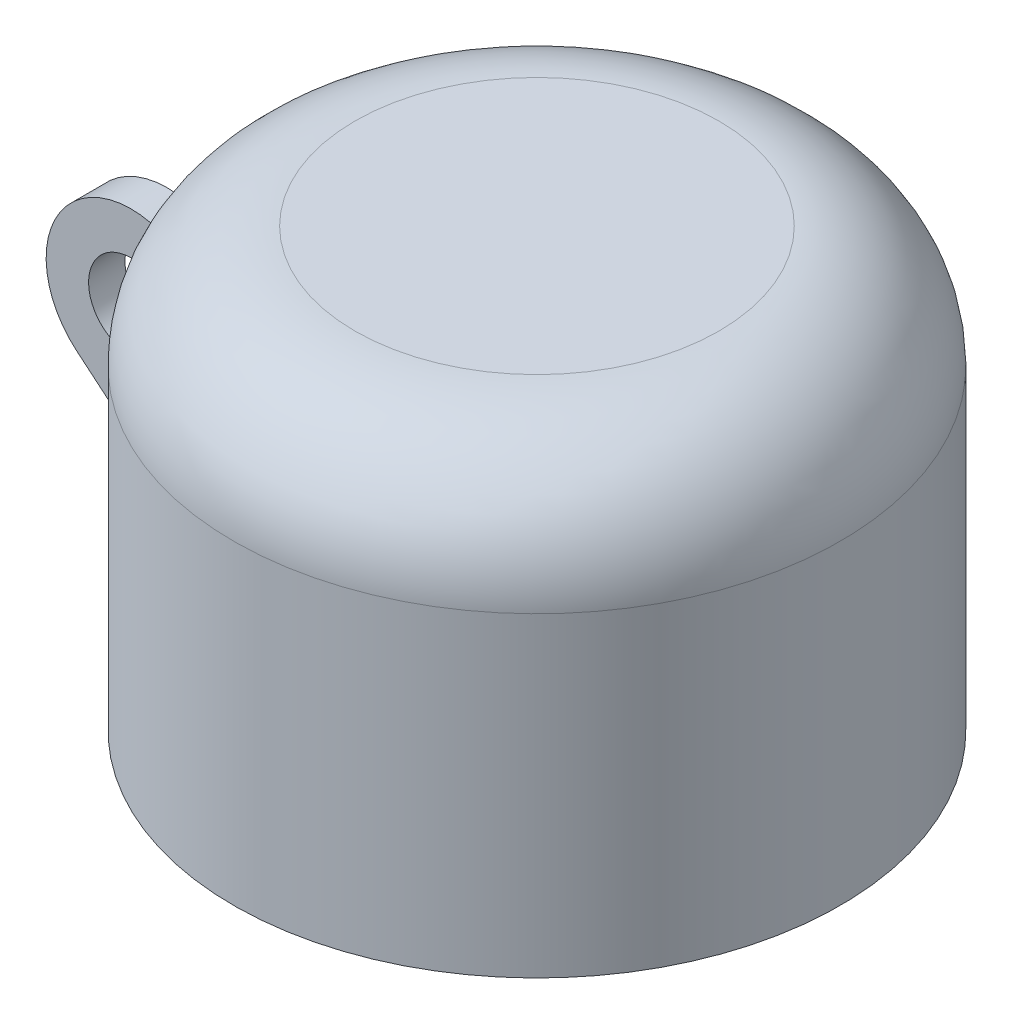
ISO-10303-21;
HEADER;
FILE_DESCRIPTION(('STEP AP214'),'2;1');
FILE_NAME('part.step','',(''),(''),'','','');
FILE_SCHEMA(('AUTOMOTIVE_DESIGN { 1 0 10303 214 1 1 1 1 }'));
ENDSEC;
DATA;
#1=APPLICATION_CONTEXT('core data for automotive mechanical design processes');
#2=APPLICATION_PROTOCOL_DEFINITION('international standard','automotive_design',2000,#1);
#3=PRODUCT_CONTEXT('',#1,'mechanical');
#4=PRODUCT('Part','Part','',(#3));
#5=PRODUCT_RELATED_PRODUCT_CATEGORY('part','',(#4));
#6=PRODUCT_DEFINITION_FORMATION('','',#4);
#7=PRODUCT_DEFINITION_CONTEXT('part definition',#1,'design');
#8=PRODUCT_DEFINITION('design','',#6,#7);
#9=PRODUCT_DEFINITION_SHAPE('','',#8);
#10=(LENGTH_UNIT() NAMED_UNIT(*) SI_UNIT(.MILLI.,.METRE.));
#11=(NAMED_UNIT(*) PLANE_ANGLE_UNIT() SI_UNIT($,.RADIAN.));
#12=(NAMED_UNIT(*) SI_UNIT($,.STERADIAN.) SOLID_ANGLE_UNIT());
#13=UNCERTAINTY_MEASURE_WITH_UNIT(LENGTH_MEASURE(1.E-05),#10,'distance_accuracy_value','');
#14=(GEOMETRIC_REPRESENTATION_CONTEXT(3) GLOBAL_UNCERTAINTY_ASSIGNED_CONTEXT((#13)) GLOBAL_UNIT_ASSIGNED_CONTEXT((#10,
#11,#12)) REPRESENTATION_CONTEXT('',''));
#15=CARTESIAN_POINT('',(0.,0.,0.));
#16=DIRECTION('',(0.,0.,1.));
#17=DIRECTION('',(1.,0.,0.));
#18=AXIS2_PLACEMENT_3D('',#15,#16,#17);
#19=CARTESIAN_POINT('',(0.,36.,0.));
#20=DIRECTION('',(0.,1.,0.));
#21=DIRECTION('',(-1.,0.,0.));
#22=AXIS2_PLACEMENT_3D('',#19,#20,#21);
#23=CYLINDRICAL_SURFACE('',#22,25.);
#24=DIRECTION('',(0.,1.,0.));
#25=VECTOR('',#24,1.);
#26=CARTESIAN_POINT('',(-24.9549594269356,36.,-1.5));
#27=LINE('',#26,#25);
#28=CARTESIAN_POINT('',(-24.9549594269356,25.9999999999999,-1.5));
#29=VERTEX_POINT('',#28);
#30=CARTESIAN_POINT('',(-24.9549594269356,15.,-1.5));
#31=VERTEX_POINT('',#30);
#32=EDGE_CURVE('E102',#29,#31,#27,.F.);
#33=ORIENTED_EDGE('',*,*,#32,.F.);
#34=CARTESIAN_POINT('',(0.,25.9999999999999,0.));
#35=DIRECTION('',(0.,1.,0.));
#36=DIRECTION('',(-1.,0.,0.));
#37=AXIS2_PLACEMENT_3D('',#34,#35,#36);
#38=CIRCLE('',#37,25.);
#39=CARTESIAN_POINT('',(-24.9549594269356,25.9999999999999,1.5));
#40=VERTEX_POINT('',#39);
#41=EDGE_CURVE('E110',#40,#29,#38,.T.);
#42=ORIENTED_EDGE('',*,*,#41,.F.);
#43=DIRECTION('',(0.,-1.,0.));
#44=VECTOR('',#43,1.);
#45=CARTESIAN_POINT('',(-24.9549594269356,25.9999999999999,1.5));
#46=LINE('',#45,#44);
#47=CARTESIAN_POINT('',(-24.9549594269356,15.,1.5));
#48=VERTEX_POINT('',#47);
#49=EDGE_CURVE('E88',#40,#48,#46,.T.);
#50=ORIENTED_EDGE('',*,*,#49,.T.);
#51=DIRECTION('',(0.,1.,0.));
#52=VECTOR('',#51,1.);
#53=CARTESIAN_POINT('',(-24.9549594269356,36.,1.5));
#54=LINE('',#53,#52);
#55=CARTESIAN_POINT('',(-24.9549594269356,0.,1.5));
#56=VERTEX_POINT('',#55);
#57=EDGE_CURVE('E108',#56,#48,#54,.T.);
#58=ORIENTED_EDGE('',*,*,#57,.F.);
#59=CARTESIAN_POINT('',(0.,0.,0.));
#60=DIRECTION('',(0.,1.,0.));
#61=DIRECTION('',(-1.,0.,0.));
#62=AXIS2_PLACEMENT_3D('',#59,#60,#61);
#63=CIRCLE('',#62,25.);
#64=CARTESIAN_POINT('',(-24.9549594269356,0.,-1.5));
#65=VERTEX_POINT('',#64);
#66=EDGE_CURVE('E93',#56,#65,#63,.T.);
#67=ORIENTED_EDGE('',*,*,#66,.T.);
#68=EDGE_CURVE('E97',#31,#65,#27,.F.);
#69=ORIENTED_EDGE('',*,*,#68,.F.);
#70=EDGE_LOOP('',(#33,#42,#50,#58,#67,#69));
#71=FACE_BOUND('',#70,.T.);
#72=ADVANCED_FACE('F40',(#71),#23,.T.);
#73=CARTESIAN_POINT('',(0.,0.,0.));
#74=DIRECTION('',(0.,1.,0.));
#75=DIRECTION('',(-1.,0.,0.));
#76=AXIS2_PLACEMENT_3D('',#73,#74,#75);
#77=PLANE('',#76);
#78=ORIENTED_EDGE('',*,*,#66,.F.);
#79=DIRECTION('',(0.,0.,1.));
#80=VECTOR('',#79,1.);
#81=CARTESIAN_POINT('',(-24.9549594269356,0.,-25.));
#82=LINE('',#81,#80);
#83=EDGE_CURVE('E58',#65,#56,#82,.T.);
#84=ORIENTED_EDGE('',*,*,#83,.F.);
#85=EDGE_LOOP('',(#78,#84));
#86=FACE_BOUND('',#85,.T.);
#87=ADVANCED_FACE('F42',(#86),#77,.F.);
#88=CARTESIAN_POINT('',(0.,26.,0.));
#89=DIRECTION('',(0.,1.,0.));
#90=DIRECTION('',(-1.,0.,0.));
#91=AXIS2_PLACEMENT_3D('',#88,#89,#90);
#92=TOROIDAL_SURFACE('',#91,15.,10.);
#93=CARTESIAN_POINT('',(0.,36.,0.));
#94=DIRECTION('',(0.,1.,0.));
#95=DIRECTION('',(-1.,0.,0.));
#96=AXIS2_PLACEMENT_3D('',#93,#94,#95);
#97=CIRCLE('',#96,14.9999999999999);
#98=CARTESIAN_POINT('',(-14.9999999999999,36.,0.));
#99=VERTEX_POINT('',#98);
#100=EDGE_CURVE('E116',#99,#99,#97,.T.);
#101=ORIENTED_EDGE('',*,*,#100,.F.);
#102=EDGE_LOOP('',(#101));
#103=FACE_BOUND('',#102,.T.);
#104=ORIENTED_EDGE('',*,*,#41,.T.);
#105=CARTESIAN_POINT('',(0.,25.9999999999999,0.));
#106=DIRECTION('',(0.,1.,0.));
#107=DIRECTION('',(-1.,0.,0.));
#108=AXIS2_PLACEMENT_3D('',#105,#106,#107);
#109=CIRCLE('',#108,25.);
#110=EDGE_CURVE('E103',#40,#29,#109,.F.);
#111=ORIENTED_EDGE('',*,*,#110,.F.);
#112=EDGE_LOOP('',(#104,#111));
#113=FACE_BOUND('',#112,.T.);
#114=ADVANCED_FACE('F163',(#103,#113),#92,.T.);
#115=CARTESIAN_POINT('',(14.9999999999999,36.,0.));
#116=DIRECTION('',(0.,-1.,0.));
#117=DIRECTION('',(1.,0.,0.));
#118=AXIS2_PLACEMENT_3D('',#115,#116,#117);
#119=PLANE('',#118);
#120=ORIENTED_EDGE('',*,*,#100,.T.);
#121=EDGE_LOOP('',(#120));
#122=FACE_BOUND('',#121,.T.);
#123=ADVANCED_FACE('F178',(#122),#119,.F.);
#124=CARTESIAN_POINT('',(-40.,25.9999999999999,-1.5));
#125=DIRECTION('',(0.,0.,1.));
#126=DIRECTION('',(0.,-1.,0.));
#127=AXIS2_PLACEMENT_3D('',#124,#125,#126);
#128=PLANE('',#127);
#129=CARTESIAN_POINT('',(-31.9549594269356,15.,-1.5));
#130=DIRECTION('',(0.,0.,1.));
#131=DIRECTION('',(0.,-1.,0.));
#132=AXIS2_PLACEMENT_3D('',#129,#130,#131);
#133=CIRCLE('',#132,3.5);
#134=CARTESIAN_POINT('',(-31.9549594269356,11.5,-1.5));
#135=VERTEX_POINT('',#134);
#136=EDGE_CURVE('E139',#135,#135,#133,.T.);
#137=ORIENTED_EDGE('',*,*,#136,.T.);
#138=EDGE_LOOP('',(#137));
#139=FACE_BOUND('',#138,.T.);
#140=DIRECTION('',(-0.766423357664234,0.642335766423357,0.));
#141=VECTOR('',#140,1.);
#142=CARTESIAN_POINT('',(-46.5923174277899,18.1341667054779,-1.5));
#143=LINE('',#142,#141);
#144=CARTESIAN_POINT('',(-36.4513097918991,9.63503649635036,-1.5));
#145=VERTEX_POINT('',#144);
#146=EDGE_CURVE('E80',#65,#145,#143,.T.);
#147=ORIENTED_EDGE('',*,*,#146,.T.);
#148=CARTESIAN_POINT('',(-31.9549594269356,15.,-1.5));
#149=DIRECTION('',(0.,0.,1.));
#150=DIRECTION('',(0.,-1.,0.));
#151=AXIS2_PLACEMENT_3D('',#148,#149,#150);
#152=CIRCLE('',#151,7.00000000000001);
#153=EDGE_CURVE('E87',#145,#31,#152,.F.);
#154=ORIENTED_EDGE('',*,*,#153,.T.);
#155=ORIENTED_EDGE('',*,*,#68,.T.);
#156=EDGE_LOOP('',(#147,#154,#155));
#157=FACE_BOUND('',#156,.T.);
#158=ADVANCED_FACE('F98',(#139,#157),#128,.F.);
#159=CARTESIAN_POINT('',(-40.,25.9999999999999,1.5));
#160=DIRECTION('',(0.,0.,-1.));
#161=DIRECTION('',(0.,1.,0.));
#162=AXIS2_PLACEMENT_3D('',#159,#160,#161);
#163=PLANE('',#162);
#164=CARTESIAN_POINT('',(-31.9549594269356,15.,1.5));
#165=DIRECTION('',(0.,0.,-1.));
#166=DIRECTION('',(0.,1.,0.));
#167=AXIS2_PLACEMENT_3D('',#164,#165,#166);
#168=CIRCLE('',#167,3.5);
#169=CARTESIAN_POINT('',(-31.9549594269356,18.5,1.5));
#170=VERTEX_POINT('',#169);
#171=EDGE_CURVE('E44',#170,#170,#168,.T.);
#172=ORIENTED_EDGE('',*,*,#171,.T.);
#173=EDGE_LOOP('',(#172));
#174=FACE_BOUND('',#173,.T.);
#175=ORIENTED_EDGE('',*,*,#57,.T.);
#176=CARTESIAN_POINT('',(-31.9549594269356,15.,1.5));
#177=DIRECTION('',(0.,0.,-1.));
#178=DIRECTION('',(0.,1.,0.));
#179=AXIS2_PLACEMENT_3D('',#176,#177,#178);
#180=CIRCLE('',#179,7.00000000000001);
#181=CARTESIAN_POINT('',(-36.4513097918991,9.63503649635036,1.5));
#182=VERTEX_POINT('',#181);
#183=EDGE_CURVE('E11',#48,#182,#180,.F.);
#184=ORIENTED_EDGE('',*,*,#183,.T.);
#185=DIRECTION('',(0.766423357664234,-0.642335766423357,0.));
#186=VECTOR('',#185,1.);
#187=CARTESIAN_POINT('',(-46.5923174277899,18.1341667054779,1.5));
#188=LINE('',#187,#186);
#189=EDGE_CURVE('E51',#182,#56,#188,.T.);
#190=ORIENTED_EDGE('',*,*,#189,.T.);
#191=EDGE_LOOP('',(#175,#184,#190));
#192=FACE_BOUND('',#191,.T.);
#193=ADVANCED_FACE('F169',(#174,#192),#163,.F.);
#194=CARTESIAN_POINT('',(-31.9549594269356,15.,-25.));
#195=DIRECTION('',(0.,0.,1.));
#196=DIRECTION('',(1.,0.,0.));
#197=AXIS2_PLACEMENT_3D('',#194,#195,#196);
#198=CYLINDRICAL_SURFACE('',#197,7.00000000000001);
#199=DIRECTION('',(0.,0.,1.));
#200=VECTOR('',#199,1.);
#201=CARTESIAN_POINT('',(-36.4513097918991,9.63503649635036,-25.));
#202=LINE('',#201,#200);
#203=EDGE_CURVE('E82',#145,#182,#202,.T.);
#204=ORIENTED_EDGE('',*,*,#203,.T.);
#205=ORIENTED_EDGE('',*,*,#183,.F.);
#206=DIRECTION('',(0.,0.,1.));
#207=VECTOR('',#206,1.);
#208=CARTESIAN_POINT('',(-24.9549594269356,15.,-25.));
#209=LINE('',#208,#207);
#210=EDGE_CURVE('E150',#31,#48,#209,.T.);
#211=ORIENTED_EDGE('',*,*,#210,.F.);
#212=ORIENTED_EDGE('',*,*,#153,.F.);
#213=EDGE_LOOP('',(#204,#205,#211,#212));
#214=FACE_BOUND('',#213,.T.);
#215=ADVANCED_FACE('F167',(#214),#198,.T.);
#216=CARTESIAN_POINT('',(-24.9549594269356,0.,-25.));
#217=DIRECTION('',(0.642335766423357,0.766423357664234,0.));
#218=DIRECTION('',(-0.766423357664234,0.642335766423357,0.));
#219=AXIS2_PLACEMENT_3D('',#216,#217,#218);
#220=PLANE('',#219);
#221=ORIENTED_EDGE('',*,*,#83,.T.);
#222=ORIENTED_EDGE('',*,*,#189,.F.);
#223=ORIENTED_EDGE('',*,*,#203,.F.);
#224=ORIENTED_EDGE('',*,*,#146,.F.);
#225=EDGE_LOOP('',(#221,#222,#223,#224));
#226=FACE_BOUND('',#225,.T.);
#227=ADVANCED_FACE('F81',(#226),#220,.F.);
#228=CARTESIAN_POINT('',(-24.9549594269356,25.9999999999999,-25.));
#229=DIRECTION('',(1.,0.,0.));
#230=DIRECTION('',(0.,1.,0.));
#231=AXIS2_PLACEMENT_3D('',#228,#229,#230);
#232=PLANE('',#231);
#233=ORIENTED_EDGE('',*,*,#210,.T.);
#234=ORIENTED_EDGE('',*,*,#49,.F.);
#235=DIRECTION('',(0.,0.,1.));
#236=VECTOR('',#235,1.);
#237=CARTESIAN_POINT('',(-24.9549594269356,25.9999999999999,-25.));
#238=LINE('',#237,#236);
#239=EDGE_CURVE('E146',#29,#40,#238,.T.);
#240=ORIENTED_EDGE('',*,*,#239,.F.);
#241=ORIENTED_EDGE('',*,*,#32,.T.);
#242=EDGE_LOOP('',(#233,#234,#240,#241));
#243=FACE_BOUND('',#242,.T.);
#244=ADVANCED_FACE('F165',(#243),#232,.F.);
#245=CARTESIAN_POINT('',(-24.9549594269356,25.9999999999999,-25.));
#246=DIRECTION('',(0.,1.,0.));
#247=DIRECTION('',(0.,0.,1.));
#248=AXIS2_PLACEMENT_3D('',#245,#246,#247);
#249=PLANE('',#248);
#250=ORIENTED_EDGE('',*,*,#239,.T.);
#251=ORIENTED_EDGE('',*,*,#110,.T.);
#252=EDGE_LOOP('',(#250,#251));
#253=FACE_BOUND('',#252,.T.);
#254=ADVANCED_FACE('F159',(#253),#249,.F.);
#255=CARTESIAN_POINT('',(-31.9549594269356,15.,-25.));
#256=DIRECTION('',(0.,0.,1.));
#257=DIRECTION('',(1.,0.,0.));
#258=AXIS2_PLACEMENT_3D('',#255,#256,#257);
#259=CYLINDRICAL_SURFACE('',#258,3.5);
#260=ORIENTED_EDGE('',*,*,#171,.F.);
#261=EDGE_LOOP('',(#260));
#262=FACE_BOUND('',#261,.T.);
#263=ORIENTED_EDGE('',*,*,#136,.F.);
#264=EDGE_LOOP('',(#263));
#265=FACE_BOUND('',#264,.T.);
#266=ADVANCED_FACE('F233',(#262,#265),#259,.F.);
#267=CLOSED_SHELL('',(#72,#87,#114,#123,#158,#193,#215,#227,#244,#254,#266));
#268=CARTESIAN_POINT('',(14.9999999999999,35.,0.));
#269=DIRECTION('',(0.,1.,0.));
#270=DIRECTION('',(-1.,0.,0.));
#271=AXIS2_PLACEMENT_3D('',#268,#269,#270);
#272=PLANE('',#271);
#273=CARTESIAN_POINT('',(0.,35.,0.));
#274=DIRECTION('',(0.,1.,0.));
#275=DIRECTION('',(-1.,0.,0.));
#276=AXIS2_PLACEMENT_3D('',#273,#274,#275);
#277=CIRCLE('',#276,14.9999999999999);
#278=CARTESIAN_POINT('',(-14.9999999999999,35.,0.));
#279=VERTEX_POINT('',#278);
#280=EDGE_CURVE('E122',#279,#279,#277,.T.);
#281=ORIENTED_EDGE('',*,*,#280,.F.);
#282=EDGE_LOOP('',(#281));
#283=FACE_BOUND('',#282,.T.);
#284=ADVANCED_FACE('F194',(#283),#272,.F.);
#285=CARTESIAN_POINT('',(0.,26.,0.));
#286=DIRECTION('',(0.,1.,0.));
#287=DIRECTION('',(-1.,0.,0.));
#288=AXIS2_PLACEMENT_3D('',#285,#286,#287);
#289=TOROIDAL_SURFACE('',#288,15.,9.);
#290=CARTESIAN_POINT('',(0.,25.9999999999999,0.));
#291=DIRECTION('',(0.,1.,0.));
#292=DIRECTION('',(-1.,0.,0.));
#293=AXIS2_PLACEMENT_3D('',#290,#291,#292);
#294=CIRCLE('',#293,24.);
#295=CARTESIAN_POINT('',(-24.,25.9999999999999,0.));
#296=VERTEX_POINT('',#295);
#297=EDGE_CURVE('E126',#296,#296,#294,.T.);
#298=ORIENTED_EDGE('',*,*,#297,.F.);
#299=EDGE_LOOP('',(#298));
#300=FACE_BOUND('',#299,.T.);
#301=ORIENTED_EDGE('',*,*,#280,.T.);
#302=EDGE_LOOP('',(#301));
#303=FACE_BOUND('',#302,.T.);
#304=ADVANCED_FACE('F197',(#300,#303),#289,.F.);
#305=CARTESIAN_POINT('',(0.,36.,0.));
#306=DIRECTION('',(0.,1.,0.));
#307=DIRECTION('',(-1.,0.,0.));
#308=AXIS2_PLACEMENT_3D('',#305,#306,#307);
#309=CYLINDRICAL_SURFACE('',#308,24.);
#310=CARTESIAN_POINT('',(0.,1.,0.));
#311=DIRECTION('',(0.,1.,0.));
#312=DIRECTION('',(-1.,0.,0.));
#313=AXIS2_PLACEMENT_3D('',#310,#311,#312);
#314=CIRCLE('',#313,24.);
#315=CARTESIAN_POINT('',(-24.,0.999999999999999,0.));
#316=VERTEX_POINT('',#315);
#317=EDGE_CURVE('E130',#316,#316,#314,.T.);
#318=ORIENTED_EDGE('',*,*,#317,.F.);
#319=EDGE_LOOP('',(#318));
#320=FACE_BOUND('',#319,.T.);
#321=ORIENTED_EDGE('',*,*,#297,.T.);
#322=EDGE_LOOP('',(#321));
#323=FACE_BOUND('',#322,.T.);
#324=ADVANCED_FACE('F202',(#320,#323),#309,.F.);
#325=CARTESIAN_POINT('',(0.,1.,0.));
#326=DIRECTION('',(0.,-1.,0.));
#327=DIRECTION('',(1.,0.,0.));
#328=AXIS2_PLACEMENT_3D('',#325,#326,#327);
#329=PLANE('',#328);
#330=ORIENTED_EDGE('',*,*,#317,.T.);
#331=EDGE_LOOP('',(#330));
#332=FACE_BOUND('',#331,.T.);
#333=ADVANCED_FACE('F206',(#332),#329,.F.);
#334=CLOSED_SHELL('',(#284,#304,#324,#333));
#335=ORIENTED_CLOSED_SHELL('',*,#334,.T.);
#336=BREP_WITH_VOIDS('B2',#267,(#335));
#337=ADVANCED_BREP_SHAPE_REPRESENTATION('',(#18,#336),#14);
#338=SHAPE_DEFINITION_REPRESENTATION(#9,#337);
ENDSEC;
END-ISO-10303-21;
